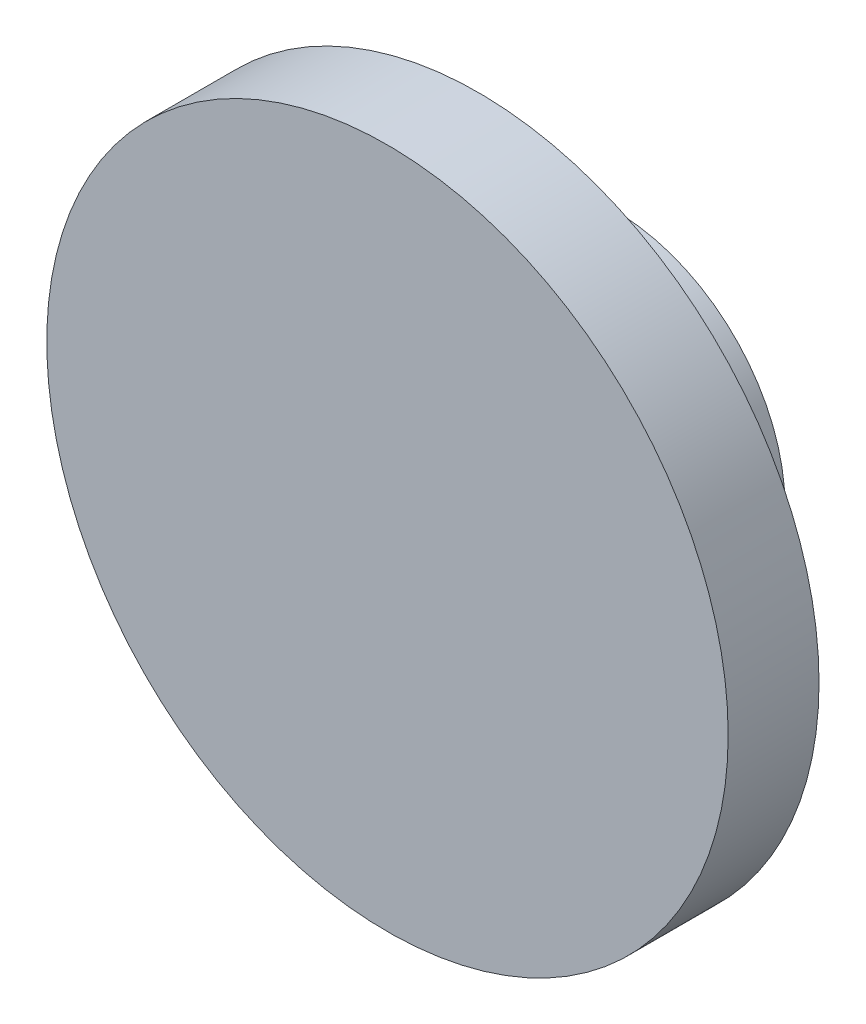
ISO-10303-21;
HEADER;
FILE_DESCRIPTION(('STEP AP214'),'2;1');
FILE_NAME('part.step','',(''),(''),'','','');
FILE_SCHEMA(('AUTOMOTIVE_DESIGN { 1 0 10303 214 1 1 1 1 }'));
ENDSEC;
DATA;
#1=APPLICATION_CONTEXT('core data for automotive mechanical design processes');
#2=APPLICATION_PROTOCOL_DEFINITION('international standard','automotive_design',2000,#1);
#3=PRODUCT_CONTEXT('',#1,'mechanical');
#4=PRODUCT('Part','Part','',(#3));
#5=PRODUCT_RELATED_PRODUCT_CATEGORY('part','',(#4));
#6=PRODUCT_DEFINITION_FORMATION('','',#4);
#7=PRODUCT_DEFINITION_CONTEXT('part definition',#1,'design');
#8=PRODUCT_DEFINITION('design','',#6,#7);
#9=PRODUCT_DEFINITION_SHAPE('','',#8);
#10=(LENGTH_UNIT() NAMED_UNIT(*) SI_UNIT(.MILLI.,.METRE.));
#11=(NAMED_UNIT(*) PLANE_ANGLE_UNIT() SI_UNIT($,.RADIAN.));
#12=(NAMED_UNIT(*) SI_UNIT($,.STERADIAN.) SOLID_ANGLE_UNIT());
#13=UNCERTAINTY_MEASURE_WITH_UNIT(LENGTH_MEASURE(1.E-05),#10,'distance_accuracy_value','');
#14=(GEOMETRIC_REPRESENTATION_CONTEXT(3) GLOBAL_UNCERTAINTY_ASSIGNED_CONTEXT((#13)) GLOBAL_UNIT_ASSIGNED_CONTEXT((#10,
#11,#12)) REPRESENTATION_CONTEXT('',''));
#15=CARTESIAN_POINT('',(0.,0.,0.));
#16=DIRECTION('',(0.,0.,1.));
#17=DIRECTION('',(1.,0.,0.));
#18=AXIS2_PLACEMENT_3D('',#15,#16,#17);
#19=CARTESIAN_POINT('',(0.,0.,4.));
#20=DIRECTION('',(0.,0.,-1.));
#21=DIRECTION('',(-1.,0.,0.));
#22=AXIS2_PLACEMENT_3D('',#19,#20,#21);
#23=CYLINDRICAL_SURFACE('',#22,15.);
#24=CARTESIAN_POINT('',(0.,0.,4.));
#25=DIRECTION('',(0.,0.,1.));
#26=DIRECTION('',(1.,0.,0.));
#27=AXIS2_PLACEMENT_3D('',#24,#25,#26);
#28=CIRCLE('',#27,15.);
#29=CARTESIAN_POINT('',(15.,0.,4.));
#30=VERTEX_POINT('',#29);
#31=EDGE_CURVE('E45',#30,#30,#28,.T.);
#32=ORIENTED_EDGE('',*,*,#31,.F.);
#33=EDGE_LOOP('',(#32));
#34=FACE_BOUND('',#33,.T.);
#35=CARTESIAN_POINT('',(0.,0.,0.));
#36=DIRECTION('',(0.,0.,1.));
#37=DIRECTION('',(1.,0.,0.));
#38=AXIS2_PLACEMENT_3D('',#35,#36,#37);
#39=CIRCLE('',#38,15.);
#40=CARTESIAN_POINT('',(15.,0.,0.));
#41=VERTEX_POINT('',#40);
#42=EDGE_CURVE('E51',#41,#41,#39,.T.);
#43=ORIENTED_EDGE('',*,*,#42,.T.);
#44=EDGE_LOOP('',(#43));
#45=FACE_BOUND('',#44,.T.);
#46=ADVANCED_FACE('F37',(#34,#45),#23,.T.);
#47=CARTESIAN_POINT('',(0.,0.,4.));
#48=DIRECTION('',(0.,0.,1.));
#49=DIRECTION('',(1.,0.,0.));
#50=AXIS2_PLACEMENT_3D('',#47,#48,#49);
#51=PLANE('',#50);
#52=ORIENTED_EDGE('',*,*,#31,.T.);
#53=EDGE_LOOP('',(#52));
#54=FACE_BOUND('',#53,.T.);
#55=ADVANCED_FACE('F82',(#54),#51,.T.);
#56=CARTESIAN_POINT('',(0.,0.,0.));
#57=DIRECTION('',(0.,0.,1.));
#58=DIRECTION('',(1.,0.,0.));
#59=AXIS2_PLACEMENT_3D('',#56,#57,#58);
#60=PLANE('',#59);
#61=CARTESIAN_POINT('',(0.,0.,0.));
#62=DIRECTION('',(0.,0.,-1.));
#63=DIRECTION('',(-1.,0.,0.));
#64=AXIS2_PLACEMENT_3D('',#61,#62,#63);
#65=CIRCLE('',#64,7.5);
#66=CARTESIAN_POINT('',(-7.5,0.,0.));
#67=VERTEX_POINT('',#66);
#68=EDGE_CURVE('E10',#67,#67,#65,.T.);
#69=ORIENTED_EDGE('',*,*,#68,.F.);
#70=EDGE_LOOP('',(#69));
#71=FACE_BOUND('',#70,.T.);
#72=ORIENTED_EDGE('',*,*,#42,.F.);
#73=EDGE_LOOP('',(#72));
#74=FACE_BOUND('',#73,.T.);
#75=ADVANCED_FACE('F78',(#71,#74),#60,.F.);
#76=CARTESIAN_POINT('',(0.,0.,-6.));
#77=DIRECTION('',(0.,0.,1.));
#78=DIRECTION('',(1.,0.,0.));
#79=AXIS2_PLACEMENT_3D('',#76,#77,#78);
#80=CYLINDRICAL_SURFACE('',#79,7.5);
#81=CARTESIAN_POINT('',(0.,0.,-6.));
#82=DIRECTION('',(0.,0.,-1.));
#83=DIRECTION('',(-1.,0.,0.));
#84=AXIS2_PLACEMENT_3D('',#81,#82,#83);
#85=CIRCLE('',#84,7.5);
#86=CARTESIAN_POINT('',(-7.5,0.,-6.));
#87=VERTEX_POINT('',#86);
#88=EDGE_CURVE('E54',#87,#87,#85,.T.);
#89=ORIENTED_EDGE('',*,*,#88,.F.);
#90=EDGE_LOOP('',(#89));
#91=FACE_BOUND('',#90,.T.);
#92=ORIENTED_EDGE('',*,*,#68,.T.);
#93=EDGE_LOOP('',(#92));
#94=FACE_BOUND('',#93,.T.);
#95=ADVANCED_FACE('F71',(#91,#94),#80,.T.);
#96=CARTESIAN_POINT('',(0.,0.,-6.));
#97=DIRECTION('',(0.,0.,-1.));
#98=DIRECTION('',(-1.,0.,0.));
#99=AXIS2_PLACEMENT_3D('',#96,#97,#98);
#100=PLANE('',#99);
#101=CARTESIAN_POINT('',(0.,0.,-6.));
#102=DIRECTION('',(0.,0.,-1.));
#103=DIRECTION('',(-1.,0.,0.));
#104=AXIS2_PLACEMENT_3D('',#101,#102,#103);
#105=CIRCLE('',#104,6.18465843842649);
#106=CARTESIAN_POINT('',(-6.18465843842649,0.,-6.));
#107=VERTEX_POINT('',#106);
#108=EDGE_CURVE('E40',#107,#107,#105,.T.);
#109=ORIENTED_EDGE('',*,*,#108,.F.);
#110=EDGE_LOOP('',(#109));
#111=FACE_BOUND('',#110,.T.);
#112=ORIENTED_EDGE('',*,*,#88,.T.);
#113=EDGE_LOOP('',(#112));
#114=FACE_BOUND('',#113,.T.);
#115=ADVANCED_FACE('F69',(#111,#114),#100,.T.);
#116=CARTESIAN_POINT('',(0.,0.,-4.));
#117=DIRECTION('',(0.,1.,0.));
#118=DIRECTION('',(0.,0.,-1.));
#119=AXIS2_PLACEMENT_3D('',#116,#117,#118);
#120=SPHERICAL_SURFACE('',#119,6.5);
#121=CARTESIAN_POINT('',(0.,0.,-4.));
#122=DIRECTION('',(0.,0.,-1.));
#123=DIRECTION('',(-1.,0.,0.));
#124=AXIS2_PLACEMENT_3D('',#121,#122,#123);
#125=SPHERICAL_SURFACE('',#124,6.5);
#126=ORIENTED_EDGE('',*,*,#108,.T.);
#127=EDGE_LOOP('',(#126));
#128=FACE_BOUND('',#127,.T.);
#129=ADVANCED_FACE('F67',(#128),#125,.F.);
#130=CLOSED_SHELL('',(#46,#55,#75,#95,#115,#129));
#131=MANIFOLD_SOLID_BREP('B2',#130);
#132=ADVANCED_BREP_SHAPE_REPRESENTATION('',(#18,#131),#14);
#133=SHAPE_DEFINITION_REPRESENTATION(#9,#132);
ENDSEC;
END-ISO-10303-21;
